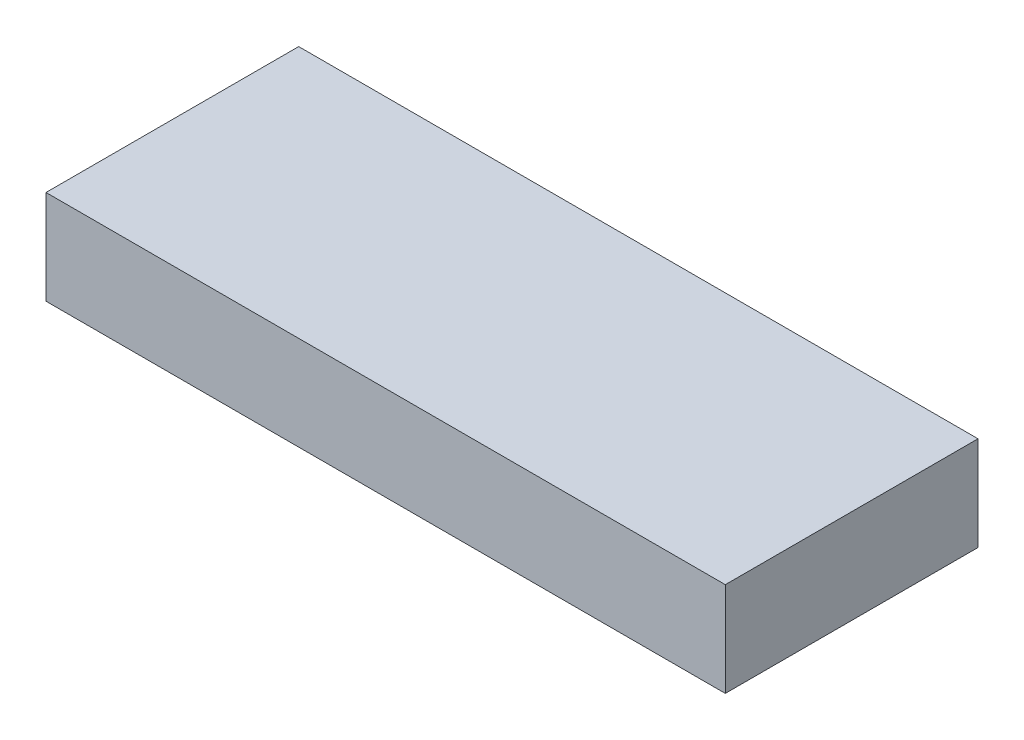
ISO-10303-21;
HEADER;
FILE_DESCRIPTION(('STEP AP214'),'2;1');
FILE_NAME('part.step','',(''),(''),'','','');
FILE_SCHEMA(('AUTOMOTIVE_DESIGN { 1 0 10303 214 1 1 1 1 }'));
ENDSEC;
DATA;
#1=APPLICATION_CONTEXT('core data for automotive mechanical design processes');
#2=APPLICATION_PROTOCOL_DEFINITION('international standard','automotive_design',2000,#1);
#3=PRODUCT_CONTEXT('',#1,'mechanical');
#4=PRODUCT('Part','Part','',(#3));
#5=PRODUCT_RELATED_PRODUCT_CATEGORY('part','',(#4));
#6=PRODUCT_DEFINITION_FORMATION('','',#4);
#7=PRODUCT_DEFINITION_CONTEXT('part definition',#1,'design');
#8=PRODUCT_DEFINITION('design','',#6,#7);
#9=PRODUCT_DEFINITION_SHAPE('','',#8);
#10=(LENGTH_UNIT() NAMED_UNIT(*) SI_UNIT(.MILLI.,.METRE.));
#11=(NAMED_UNIT(*) PLANE_ANGLE_UNIT() SI_UNIT($,.RADIAN.));
#12=(NAMED_UNIT(*) SI_UNIT($,.STERADIAN.) SOLID_ANGLE_UNIT());
#13=UNCERTAINTY_MEASURE_WITH_UNIT(LENGTH_MEASURE(1.E-05),#10,'distance_accuracy_value','');
#14=(GEOMETRIC_REPRESENTATION_CONTEXT(3) GLOBAL_UNCERTAINTY_ASSIGNED_CONTEXT((#13)) GLOBAL_UNIT_ASSIGNED_CONTEXT((#10,
#11,#12)) REPRESENTATION_CONTEXT('',''));
#15=CARTESIAN_POINT('',(0.,0.,0.));
#16=DIRECTION('',(0.,0.,1.));
#17=DIRECTION('',(1.,0.,0.));
#18=AXIS2_PLACEMENT_3D('',#15,#16,#17);
#19=CARTESIAN_POINT('',(0.,5.2832,0.));
#20=DIRECTION('',(1.,0.,0.));
#21=DIRECTION('',(0.,0.,-1.));
#22=AXIS2_PLACEMENT_3D('',#19,#20,#21);
#23=PLANE('',#22);
#24=DIRECTION('',(0.,0.,1.));
#25=VECTOR('',#24,1.);
#26=CARTESIAN_POINT('',(0.,0.,0.));
#27=LINE('',#26,#25);
#28=CARTESIAN_POINT('',(0.,0.,-14.1732));
#29=VERTEX_POINT('',#28);
#30=CARTESIAN_POINT('',(0.,0.,0.));
#31=VERTEX_POINT('',#30);
#32=EDGE_CURVE('E107',#29,#31,#27,.T.);
#33=ORIENTED_EDGE('',*,*,#32,.T.);
#34=DIRECTION('',(0.,-1.,0.));
#35=VECTOR('',#34,1.);
#36=CARTESIAN_POINT('',(0.,5.2832,0.));
#37=LINE('',#36,#35);
#38=CARTESIAN_POINT('',(0.,5.2832,0.));
#39=VERTEX_POINT('',#38);
#40=EDGE_CURVE('E11',#39,#31,#37,.T.);
#41=ORIENTED_EDGE('',*,*,#40,.F.);
#42=DIRECTION('',(0.,0.,1.));
#43=VECTOR('',#42,1.);
#44=CARTESIAN_POINT('',(0.,5.2832,0.));
#45=LINE('',#44,#43);
#46=CARTESIAN_POINT('',(0.,5.2832,-14.1732));
#47=VERTEX_POINT('',#46);
#48=EDGE_CURVE('E91',#47,#39,#45,.T.);
#49=ORIENTED_EDGE('',*,*,#48,.F.);
#50=DIRECTION('',(0.,-1.,0.));
#51=VECTOR('',#50,1.);
#52=CARTESIAN_POINT('',(0.,5.2832,-14.1732));
#53=LINE('',#52,#51);
#54=EDGE_CURVE('E103',#47,#29,#53,.T.);
#55=ORIENTED_EDGE('',*,*,#54,.T.);
#56=EDGE_LOOP('',(#33,#41,#49,#55));
#57=FACE_BOUND('',#56,.T.);
#58=ADVANCED_FACE('F39',(#57),#23,.F.);
#59=CARTESIAN_POINT('',(0.,5.2832,0.));
#60=DIRECTION('',(0.,0.,-1.));
#61=DIRECTION('',(-1.,0.,0.));
#62=AXIS2_PLACEMENT_3D('',#59,#60,#61);
#63=PLANE('',#62);
#64=DIRECTION('',(1.,0.,0.));
#65=VECTOR('',#64,1.);
#66=CARTESIAN_POINT('',(0.,0.,0.));
#67=LINE('',#66,#65);
#68=CARTESIAN_POINT('',(38.1,0.,0.));
#69=VERTEX_POINT('',#68);
#70=EDGE_CURVE('E96',#31,#69,#67,.T.);
#71=ORIENTED_EDGE('',*,*,#70,.T.);
#72=DIRECTION('',(0.,-1.,0.));
#73=VECTOR('',#72,1.);
#74=CARTESIAN_POINT('',(38.1,5.2832,0.));
#75=LINE('',#74,#73);
#76=CARTESIAN_POINT('',(38.1,5.2832,0.));
#77=VERTEX_POINT('',#76);
#78=EDGE_CURVE('E48',#77,#69,#75,.T.);
#79=ORIENTED_EDGE('',*,*,#78,.F.);
#80=DIRECTION('',(1.,0.,0.));
#81=VECTOR('',#80,1.);
#82=CARTESIAN_POINT('',(0.,5.2832,0.));
#83=LINE('',#82,#81);
#84=EDGE_CURVE('E86',#39,#77,#83,.T.);
#85=ORIENTED_EDGE('',*,*,#84,.F.);
#86=ORIENTED_EDGE('',*,*,#40,.T.);
#87=EDGE_LOOP('',(#71,#79,#85,#86));
#88=FACE_BOUND('',#87,.T.);
#89=ADVANCED_FACE('F95',(#88),#63,.F.);
#90=CARTESIAN_POINT('',(38.1,5.2832,0.));
#91=DIRECTION('',(-1.,0.,0.));
#92=DIRECTION('',(0.,0.,1.));
#93=AXIS2_PLACEMENT_3D('',#90,#91,#92);
#94=PLANE('',#93);
#95=DIRECTION('',(0.,0.,-1.));
#96=VECTOR('',#95,1.);
#97=CARTESIAN_POINT('',(38.1,0.,0.));
#98=LINE('',#97,#96);
#99=CARTESIAN_POINT('',(38.1,0.,-14.1732));
#100=VERTEX_POINT('',#99);
#101=EDGE_CURVE('E73',#69,#100,#98,.T.);
#102=ORIENTED_EDGE('',*,*,#101,.T.);
#103=DIRECTION('',(0.,-1.,0.));
#104=VECTOR('',#103,1.);
#105=CARTESIAN_POINT('',(38.1,5.2832,-14.1732));
#106=LINE('',#105,#104);
#107=CARTESIAN_POINT('',(38.1,5.2832,-14.1732));
#108=VERTEX_POINT('',#107);
#109=EDGE_CURVE('E98',#108,#100,#106,.T.);
#110=ORIENTED_EDGE('',*,*,#109,.F.);
#111=DIRECTION('',(0.,0.,-1.));
#112=VECTOR('',#111,1.);
#113=CARTESIAN_POINT('',(38.1,5.2832,0.));
#114=LINE('',#113,#112);
#115=EDGE_CURVE('E89',#77,#108,#114,.T.);
#116=ORIENTED_EDGE('',*,*,#115,.F.);
#117=ORIENTED_EDGE('',*,*,#78,.T.);
#118=EDGE_LOOP('',(#102,#110,#116,#117));
#119=FACE_BOUND('',#118,.T.);
#120=ADVANCED_FACE('F99',(#119),#94,.F.);
#121=CARTESIAN_POINT('',(0.,5.2832,-14.1732));
#122=DIRECTION('',(0.,0.,1.));
#123=DIRECTION('',(1.,0.,0.));
#124=AXIS2_PLACEMENT_3D('',#121,#122,#123);
#125=PLANE('',#124);
#126=DIRECTION('',(-1.,0.,0.));
#127=VECTOR('',#126,1.);
#128=CARTESIAN_POINT('',(0.,0.,-14.1732));
#129=LINE('',#128,#127);
#130=EDGE_CURVE('E79',#100,#29,#129,.T.);
#131=ORIENTED_EDGE('',*,*,#130,.T.);
#132=ORIENTED_EDGE('',*,*,#54,.F.);
#133=DIRECTION('',(-1.,0.,0.));
#134=VECTOR('',#133,1.);
#135=CARTESIAN_POINT('',(0.,5.2832,-14.1732));
#136=LINE('',#135,#134);
#137=EDGE_CURVE('E56',#108,#47,#136,.T.);
#138=ORIENTED_EDGE('',*,*,#137,.F.);
#139=ORIENTED_EDGE('',*,*,#109,.T.);
#140=EDGE_LOOP('',(#131,#132,#138,#139));
#141=FACE_BOUND('',#140,.T.);
#142=ADVANCED_FACE('F120',(#141),#125,.F.);
#143=CARTESIAN_POINT('',(0.,5.2832,0.));
#144=DIRECTION('',(0.,-1.,0.));
#145=DIRECTION('',(0.,0.,-1.));
#146=AXIS2_PLACEMENT_3D('',#143,#144,#145);
#147=PLANE('',#146);
#148=ORIENTED_EDGE('',*,*,#48,.T.);
#149=ORIENTED_EDGE('',*,*,#84,.T.);
#150=ORIENTED_EDGE('',*,*,#115,.T.);
#151=ORIENTED_EDGE('',*,*,#137,.T.);
#152=EDGE_LOOP('',(#148,#149,#150,#151));
#153=FACE_BOUND('',#152,.T.);
#154=ADVANCED_FACE('F87',(#153),#147,.F.);
#155=CARTESIAN_POINT('',(0.,0.,0.));
#156=DIRECTION('',(0.,-1.,0.));
#157=DIRECTION('',(0.,0.,-1.));
#158=AXIS2_PLACEMENT_3D('',#155,#156,#157);
#159=PLANE('',#158);
#160=ORIENTED_EDGE('',*,*,#32,.F.);
#161=ORIENTED_EDGE('',*,*,#130,.F.);
#162=ORIENTED_EDGE('',*,*,#101,.F.);
#163=ORIENTED_EDGE('',*,*,#70,.F.);
#164=EDGE_LOOP('',(#160,#161,#162,#163));
#165=FACE_BOUND('',#164,.T.);
#166=ADVANCED_FACE('F123',(#165),#159,.T.);
#167=CLOSED_SHELL('',(#58,#89,#120,#142,#154,#166));
#168=MANIFOLD_SOLID_BREP('B2',#167);
#169=ADVANCED_BREP_SHAPE_REPRESENTATION('',(#18,#168),#14);
#170=SHAPE_DEFINITION_REPRESENTATION(#9,#169);
ENDSEC;
END-ISO-10303-21;
